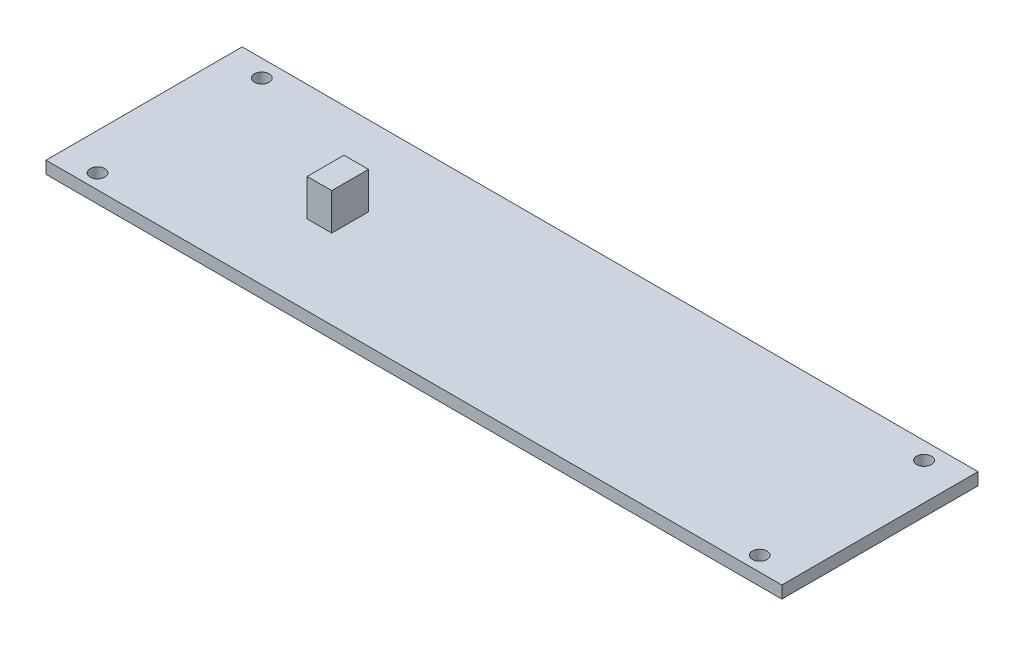
ISO-10303-21;
HEADER;
FILE_DESCRIPTION(('STEP AP214'),'2;1');
FILE_NAME('part.step','',(''),(''),'','','');
FILE_SCHEMA(('AUTOMOTIVE_DESIGN { 1 0 10303 214 1 1 1 1 }'));
ENDSEC;
DATA;
#1=APPLICATION_CONTEXT('core data for automotive mechanical design processes');
#2=APPLICATION_PROTOCOL_DEFINITION('international standard','automotive_design',2000,#1);
#3=PRODUCT_CONTEXT('',#1,'mechanical');
#4=PRODUCT('Part','Part','',(#3));
#5=PRODUCT_RELATED_PRODUCT_CATEGORY('part','',(#4));
#6=PRODUCT_DEFINITION_FORMATION('','',#4);
#7=PRODUCT_DEFINITION_CONTEXT('part definition',#1,'design');
#8=PRODUCT_DEFINITION('design','',#6,#7);
#9=PRODUCT_DEFINITION_SHAPE('','',#8);
#10=(LENGTH_UNIT() NAMED_UNIT(*) SI_UNIT(.MILLI.,.METRE.));
#11=(NAMED_UNIT(*) PLANE_ANGLE_UNIT() SI_UNIT($,.RADIAN.));
#12=(NAMED_UNIT(*) SI_UNIT($,.STERADIAN.) SOLID_ANGLE_UNIT());
#13=UNCERTAINTY_MEASURE_WITH_UNIT(LENGTH_MEASURE(1.E-05),#10,'distance_accuracy_value','');
#14=(GEOMETRIC_REPRESENTATION_CONTEXT(3) GLOBAL_UNCERTAINTY_ASSIGNED_CONTEXT((#13)) GLOBAL_UNIT_ASSIGNED_CONTEXT((#10,
#11,#12)) REPRESENTATION_CONTEXT('',''));
#15=CARTESIAN_POINT('',(0.,0.,0.));
#16=DIRECTION('',(0.,0.,1.));
#17=DIRECTION('',(1.,0.,0.));
#18=AXIS2_PLACEMENT_3D('',#15,#16,#17);
#19=CARTESIAN_POINT('',(0.,5.,0.));
#20=DIRECTION('',(0.,1.,0.));
#21=DIRECTION('',(0.,0.,1.));
#22=AXIS2_PLACEMENT_3D('',#19,#20,#21);
#23=PLANE('',#22);
#24=CARTESIAN_POINT('',(15.,5.,74.));
#25=DIRECTION('',(0.,1.,0.));
#26=DIRECTION('',(0.,0.,1.));
#27=AXIS2_PLACEMENT_3D('',#24,#25,#26);
#28=CIRCLE('',#27,3.);
#29=CARTESIAN_POINT('',(15.,5.,77.));
#30=VERTEX_POINT('',#29);
#31=EDGE_CURVE('E155',#30,#30,#28,.T.);
#32=ORIENTED_EDGE('',*,*,#31,.F.);
#33=EDGE_LOOP('',(#32));
#34=FACE_BOUND('',#33,.T.);
#35=CARTESIAN_POINT('',(285.,5.,7.));
#36=DIRECTION('',(0.,1.,0.));
#37=DIRECTION('',(0.,0.,-1.));
#38=AXIS2_PLACEMENT_3D('',#35,#36,#37);
#39=CIRCLE('',#38,3.00000000000005);
#40=CARTESIAN_POINT('',(285.,5.,3.99999999999995));
#41=VERTEX_POINT('',#40);
#42=EDGE_CURVE('E148',#41,#41,#39,.T.);
#43=ORIENTED_EDGE('',*,*,#42,.F.);
#44=EDGE_LOOP('',(#43));
#45=FACE_BOUND('',#44,.T.);
#46=CARTESIAN_POINT('',(285.,5.,74.));
#47=DIRECTION('',(0.,1.,0.));
#48=DIRECTION('',(0.,0.,-1.));
#49=AXIS2_PLACEMENT_3D('',#46,#47,#48);
#50=CIRCLE('',#49,3.00000000000005);
#51=CARTESIAN_POINT('',(285.,5.,71.));
#52=VERTEX_POINT('',#51);
#53=EDGE_CURVE('E144',#52,#52,#50,.T.);
#54=ORIENTED_EDGE('',*,*,#53,.F.);
#55=EDGE_LOOP('',(#54));
#56=FACE_BOUND('',#55,.T.);
#57=CARTESIAN_POINT('',(15.,5.,7.));
#58=DIRECTION('',(0.,1.,0.));
#59=DIRECTION('',(0.,0.,1.));
#60=AXIS2_PLACEMENT_3D('',#57,#58,#59);
#61=CIRCLE('',#60,3.);
#62=CARTESIAN_POINT('',(15.,5.,10.));
#63=VERTEX_POINT('',#62);
#64=EDGE_CURVE('E154',#63,#63,#61,.T.);
#65=ORIENTED_EDGE('',*,*,#64,.F.);
#66=EDGE_LOOP('',(#65));
#67=FACE_BOUND('',#66,.T.);
#68=DIRECTION('',(0.,0.,1.));
#69=VECTOR('',#68,1.);
#70=CARTESIAN_POINT('',(0.,5.,0.));
#71=LINE('',#70,#69);
#72=CARTESIAN_POINT('',(0.,5.,0.));
#73=VERTEX_POINT('',#72);
#74=CARTESIAN_POINT('',(0.,5.,80.));
#75=VERTEX_POINT('',#74);
#76=EDGE_CURVE('E169',#73,#75,#71,.T.);
#77=ORIENTED_EDGE('',*,*,#76,.T.);
#78=DIRECTION('',(1.,0.,0.));
#79=VECTOR('',#78,1.);
#80=CARTESIAN_POINT('',(0.,5.,80.));
#81=LINE('',#80,#79);
#82=CARTESIAN_POINT('',(300.,5.,80.));
#83=VERTEX_POINT('',#82);
#84=EDGE_CURVE('E85',#75,#83,#81,.T.);
#85=ORIENTED_EDGE('',*,*,#84,.T.);
#86=DIRECTION('',(0.,0.,-1.));
#87=VECTOR('',#86,1.);
#88=CARTESIAN_POINT('',(300.,5.,0.));
#89=LINE('',#88,#87);
#90=CARTESIAN_POINT('',(300.,5.,0.));
#91=VERTEX_POINT('',#90);
#92=EDGE_CURVE('E172',#83,#91,#89,.T.);
#93=ORIENTED_EDGE('',*,*,#92,.T.);
#94=DIRECTION('',(-1.,0.,0.));
#95=VECTOR('',#94,1.);
#96=CARTESIAN_POINT('',(0.,5.,0.));
#97=LINE('',#96,#95);
#98=EDGE_CURVE('E57',#91,#73,#97,.T.);
#99=ORIENTED_EDGE('',*,*,#98,.T.);
#100=EDGE_LOOP('',(#77,#85,#93,#99));
#101=FACE_BOUND('',#100,.T.);
#102=DIRECTION('',(1.,0.,0.));
#103=VECTOR('',#102,1.);
#104=CARTESIAN_POINT('',(0.,5.,32.5));
#105=LINE('',#104,#103);
#106=CARTESIAN_POINT('',(74.,5.,32.5));
#107=VERTEX_POINT('',#106);
#108=CARTESIAN_POINT('',(84.,5.,32.5));
#109=VERTEX_POINT('',#108);
#110=EDGE_CURVE('E141',#107,#109,#105,.T.);
#111=ORIENTED_EDGE('',*,*,#110,.T.);
#112=DIRECTION('',(0.,0.,1.));
#113=VECTOR('',#112,1.);
#114=CARTESIAN_POINT('',(84.,5.,0.));
#115=LINE('',#114,#113);
#116=CARTESIAN_POINT('',(84.,5.,47.5));
#117=VERTEX_POINT('',#116);
#118=EDGE_CURVE('E130',#109,#117,#115,.T.);
#119=ORIENTED_EDGE('',*,*,#118,.T.);
#120=DIRECTION('',(-1.,0.,0.));
#121=VECTOR('',#120,1.);
#122=CARTESIAN_POINT('',(0.,5.,47.5));
#123=LINE('',#122,#121);
#124=CARTESIAN_POINT('',(74.,5.,47.5));
#125=VERTEX_POINT('',#124);
#126=EDGE_CURVE('E131',#117,#125,#123,.T.);
#127=ORIENTED_EDGE('',*,*,#126,.T.);
#128=DIRECTION('',(0.,0.,-1.));
#129=VECTOR('',#128,1.);
#130=CARTESIAN_POINT('',(74.,5.,0.));
#131=LINE('',#130,#129);
#132=EDGE_CURVE('E134',#125,#107,#131,.T.);
#133=ORIENTED_EDGE('',*,*,#132,.T.);
#134=EDGE_LOOP('',(#111,#119,#127,#133));
#135=FACE_BOUND('',#134,.T.);
#136=ADVANCED_FACE('F33',(#34,#45,#56,#67,#101,#135),#23,.T.);
#137=CARTESIAN_POINT('',(0.,5.,0.));
#138=DIRECTION('',(1.,0.,0.));
#139=DIRECTION('',(0.,0.,-1.));
#140=AXIS2_PLACEMENT_3D('',#137,#138,#139);
#141=PLANE('',#140);
#142=DIRECTION('',(0.,0.,1.));
#143=VECTOR('',#142,1.);
#144=CARTESIAN_POINT('',(0.,0.,0.));
#145=LINE('',#144,#143);
#146=CARTESIAN_POINT('',(0.,0.,0.));
#147=VERTEX_POINT('',#146);
#148=CARTESIAN_POINT('',(0.,0.,80.));
#149=VERTEX_POINT('',#148);
#150=EDGE_CURVE('E166',#147,#149,#145,.T.);
#151=ORIENTED_EDGE('',*,*,#150,.T.);
#152=DIRECTION('',(0.,-1.,0.));
#153=VECTOR('',#152,1.);
#154=CARTESIAN_POINT('',(0.,5.,80.));
#155=LINE('',#154,#153);
#156=EDGE_CURVE('E11',#75,#149,#155,.T.);
#157=ORIENTED_EDGE('',*,*,#156,.F.);
#158=ORIENTED_EDGE('',*,*,#76,.F.);
#159=DIRECTION('',(0.,-1.,0.));
#160=VECTOR('',#159,1.);
#161=CARTESIAN_POINT('',(0.,5.,0.));
#162=LINE('',#161,#160);
#163=EDGE_CURVE('E175',#73,#147,#162,.T.);
#164=ORIENTED_EDGE('',*,*,#163,.T.);
#165=EDGE_LOOP('',(#151,#157,#158,#164));
#166=FACE_BOUND('',#165,.T.);
#167=ADVANCED_FACE('F35',(#166),#141,.F.);
#168=CARTESIAN_POINT('',(0.,5.,80.));
#169=DIRECTION('',(0.,0.,-1.));
#170=DIRECTION('',(-1.,0.,0.));
#171=AXIS2_PLACEMENT_3D('',#168,#169,#170);
#172=PLANE('',#171);
#173=DIRECTION('',(1.,0.,0.));
#174=VECTOR('',#173,1.);
#175=CARTESIAN_POINT('',(0.,0.,80.));
#176=LINE('',#175,#174);
#177=CARTESIAN_POINT('',(300.,0.,80.));
#178=VERTEX_POINT('',#177);
#179=EDGE_CURVE('E178',#149,#178,#176,.T.);
#180=ORIENTED_EDGE('',*,*,#179,.T.);
#181=DIRECTION('',(0.,-1.,0.));
#182=VECTOR('',#181,1.);
#183=CARTESIAN_POINT('',(300.,5.,80.));
#184=LINE('',#183,#182);
#185=EDGE_CURVE('E41',#83,#178,#184,.T.);
#186=ORIENTED_EDGE('',*,*,#185,.F.);
#187=ORIENTED_EDGE('',*,*,#84,.F.);
#188=ORIENTED_EDGE('',*,*,#156,.T.);
#189=EDGE_LOOP('',(#180,#186,#187,#188));
#190=FACE_BOUND('',#189,.T.);
#191=ADVANCED_FACE('F207',(#190),#172,.F.);
#192=CARTESIAN_POINT('',(300.,5.,0.));
#193=DIRECTION('',(-1.,0.,0.));
#194=DIRECTION('',(0.,0.,1.));
#195=AXIS2_PLACEMENT_3D('',#192,#193,#194);
#196=PLANE('',#195);
#197=DIRECTION('',(0.,0.,-1.));
#198=VECTOR('',#197,1.);
#199=CARTESIAN_POINT('',(300.,0.,0.));
#200=LINE('',#199,#198);
#201=CARTESIAN_POINT('',(300.,0.,0.));
#202=VERTEX_POINT('',#201);
#203=EDGE_CURVE('E180',#178,#202,#200,.T.);
#204=ORIENTED_EDGE('',*,*,#203,.T.);
#205=DIRECTION('',(0.,-1.,0.));
#206=VECTOR('',#205,1.);
#207=CARTESIAN_POINT('',(300.,5.,0.));
#208=LINE('',#207,#206);
#209=EDGE_CURVE('E184',#91,#202,#208,.T.);
#210=ORIENTED_EDGE('',*,*,#209,.F.);
#211=ORIENTED_EDGE('',*,*,#92,.F.);
#212=ORIENTED_EDGE('',*,*,#185,.T.);
#213=EDGE_LOOP('',(#204,#210,#211,#212));
#214=FACE_BOUND('',#213,.T.);
#215=ADVANCED_FACE('F189',(#214),#196,.F.);
#216=CARTESIAN_POINT('',(0.,5.,0.));
#217=DIRECTION('',(0.,0.,1.));
#218=DIRECTION('',(1.,0.,0.));
#219=AXIS2_PLACEMENT_3D('',#216,#217,#218);
#220=PLANE('',#219);
#221=DIRECTION('',(-1.,0.,0.));
#222=VECTOR('',#221,1.);
#223=CARTESIAN_POINT('',(0.,0.,0.));
#224=LINE('',#223,#222);
#225=EDGE_CURVE('E78',#202,#147,#224,.T.);
#226=ORIENTED_EDGE('',*,*,#225,.T.);
#227=ORIENTED_EDGE('',*,*,#163,.F.);
#228=ORIENTED_EDGE('',*,*,#98,.F.);
#229=ORIENTED_EDGE('',*,*,#209,.T.);
#230=EDGE_LOOP('',(#226,#227,#228,#229));
#231=FACE_BOUND('',#230,.T.);
#232=ADVANCED_FACE('F198',(#231),#220,.F.);
#233=CARTESIAN_POINT('',(0.,0.,0.));
#234=DIRECTION('',(0.,1.,0.));
#235=DIRECTION('',(0.,0.,1.));
#236=AXIS2_PLACEMENT_3D('',#233,#234,#235);
#237=PLANE('',#236);
#238=ORIENTED_EDGE('',*,*,#150,.F.);
#239=ORIENTED_EDGE('',*,*,#225,.F.);
#240=ORIENTED_EDGE('',*,*,#203,.F.);
#241=ORIENTED_EDGE('',*,*,#179,.F.);
#242=EDGE_LOOP('',(#238,#239,#240,#241));
#243=FACE_BOUND('',#242,.T.);
#244=CARTESIAN_POINT('',(15.,0.,7.));
#245=DIRECTION('',(0.,1.,0.));
#246=DIRECTION('',(0.,0.,1.));
#247=AXIS2_PLACEMENT_3D('',#244,#245,#246);
#248=CIRCLE('',#247,3.);
#249=CARTESIAN_POINT('',(15.,0.,10.));
#250=VERTEX_POINT('',#249);
#251=EDGE_CURVE('E163',#250,#250,#248,.T.);
#252=ORIENTED_EDGE('',*,*,#251,.T.);
#253=EDGE_LOOP('',(#252));
#254=FACE_BOUND('',#253,.T.);
#255=CARTESIAN_POINT('',(285.,0.,74.));
#256=DIRECTION('',(0.,1.,0.));
#257=DIRECTION('',(0.,0.,-1.));
#258=AXIS2_PLACEMENT_3D('',#255,#256,#257);
#259=CIRCLE('',#258,3.00000000000005);
#260=CARTESIAN_POINT('',(285.,0.,71.));
#261=VERTEX_POINT('',#260);
#262=EDGE_CURVE('E145',#261,#261,#259,.T.);
#263=ORIENTED_EDGE('',*,*,#262,.T.);
#264=EDGE_LOOP('',(#263));
#265=FACE_BOUND('',#264,.T.);
#266=CARTESIAN_POINT('',(285.,0.,7.));
#267=DIRECTION('',(0.,1.,0.));
#268=DIRECTION('',(0.,0.,-1.));
#269=AXIS2_PLACEMENT_3D('',#266,#267,#268);
#270=CIRCLE('',#269,3.00000000000005);
#271=CARTESIAN_POINT('',(285.,0.,3.99999999999995));
#272=VERTEX_POINT('',#271);
#273=EDGE_CURVE('E158',#272,#272,#270,.T.);
#274=ORIENTED_EDGE('',*,*,#273,.T.);
#275=EDGE_LOOP('',(#274));
#276=FACE_BOUND('',#275,.T.);
#277=CARTESIAN_POINT('',(15.,0.,74.));
#278=DIRECTION('',(0.,1.,0.));
#279=DIRECTION('',(0.,0.,1.));
#280=AXIS2_PLACEMENT_3D('',#277,#278,#279);
#281=CIRCLE('',#280,3.);
#282=CARTESIAN_POINT('',(15.,0.,77.));
#283=VERTEX_POINT('',#282);
#284=EDGE_CURVE('E151',#283,#283,#281,.T.);
#285=ORIENTED_EDGE('',*,*,#284,.T.);
#286=EDGE_LOOP('',(#285));
#287=FACE_BOUND('',#286,.T.);
#288=ADVANCED_FACE('F193',(#243,#254,#265,#276,#287),#237,.F.);
#289=CARTESIAN_POINT('',(15.,0.,7.));
#290=DIRECTION('',(0.,1.,0.));
#291=DIRECTION('',(0.,0.,1.));
#292=AXIS2_PLACEMENT_3D('',#289,#290,#291);
#293=CYLINDRICAL_SURFACE('',#292,3.);
#294=ORIENTED_EDGE('',*,*,#251,.F.);
#295=EDGE_LOOP('',(#294));
#296=FACE_BOUND('',#295,.T.);
#297=ORIENTED_EDGE('',*,*,#64,.T.);
#298=EDGE_LOOP('',(#297));
#299=FACE_BOUND('',#298,.T.);
#300=ADVANCED_FACE('F205',(#296,#299),#293,.F.);
#301=CARTESIAN_POINT('',(285.,0.,74.));
#302=DIRECTION('',(0.,1.,0.));
#303=DIRECTION('',(0.,0.,1.));
#304=AXIS2_PLACEMENT_3D('',#301,#302,#303);
#305=CYLINDRICAL_SURFACE('',#304,3.00000000000005);
#306=ORIENTED_EDGE('',*,*,#262,.F.);
#307=EDGE_LOOP('',(#306));
#308=FACE_BOUND('',#307,.T.);
#309=ORIENTED_EDGE('',*,*,#53,.T.);
#310=EDGE_LOOP('',(#309));
#311=FACE_BOUND('',#310,.T.);
#312=ADVANCED_FACE('F220',(#308,#311),#305,.F.);
#313=CARTESIAN_POINT('',(285.,0.,7.));
#314=DIRECTION('',(0.,1.,0.));
#315=DIRECTION('',(0.,0.,1.));
#316=AXIS2_PLACEMENT_3D('',#313,#314,#315);
#317=CYLINDRICAL_SURFACE('',#316,3.00000000000005);
#318=ORIENTED_EDGE('',*,*,#273,.F.);
#319=EDGE_LOOP('',(#318));
#320=FACE_BOUND('',#319,.T.);
#321=ORIENTED_EDGE('',*,*,#42,.T.);
#322=EDGE_LOOP('',(#321));
#323=FACE_BOUND('',#322,.T.);
#324=ADVANCED_FACE('F222',(#320,#323),#317,.F.);
#325=CARTESIAN_POINT('',(15.,0.,74.));
#326=DIRECTION('',(0.,1.,0.));
#327=DIRECTION('',(0.,0.,1.));
#328=AXIS2_PLACEMENT_3D('',#325,#326,#327);
#329=CYLINDRICAL_SURFACE('',#328,3.);
#330=ORIENTED_EDGE('',*,*,#284,.F.);
#331=EDGE_LOOP('',(#330));
#332=FACE_BOUND('',#331,.T.);
#333=ORIENTED_EDGE('',*,*,#31,.T.);
#334=EDGE_LOOP('',(#333));
#335=FACE_BOUND('',#334,.T.);
#336=ADVANCED_FACE('F225',(#332,#335),#329,.F.);
#337=CARTESIAN_POINT('',(84.,20.,47.5));
#338=DIRECTION('',(-1.,0.,0.));
#339=DIRECTION('',(0.,0.,1.));
#340=AXIS2_PLACEMENT_3D('',#337,#338,#339);
#341=PLANE('',#340);
#342=ORIENTED_EDGE('',*,*,#118,.F.);
#343=DIRECTION('',(0.,-1.,0.));
#344=VECTOR('',#343,1.);
#345=CARTESIAN_POINT('',(84.,20.,32.5));
#346=LINE('',#345,#344);
#347=CARTESIAN_POINT('',(84.,20.,32.5));
#348=VERTEX_POINT('',#347);
#349=EDGE_CURVE('E112',#348,#109,#346,.T.);
#350=ORIENTED_EDGE('',*,*,#349,.F.);
#351=DIRECTION('',(0.,0.,-1.));
#352=VECTOR('',#351,1.);
#353=CARTESIAN_POINT('',(84.,20.,47.5));
#354=LINE('',#353,#352);
#355=CARTESIAN_POINT('',(84.,20.,47.5));
#356=VERTEX_POINT('',#355);
#357=EDGE_CURVE('E119',#356,#348,#354,.T.);
#358=ORIENTED_EDGE('',*,*,#357,.F.);
#359=DIRECTION('',(0.,-1.,0.));
#360=VECTOR('',#359,1.);
#361=CARTESIAN_POINT('',(84.,20.,47.5));
#362=LINE('',#361,#360);
#363=EDGE_CURVE('E332',#356,#117,#362,.T.);
#364=ORIENTED_EDGE('',*,*,#363,.T.);
#365=EDGE_LOOP('',(#342,#350,#358,#364));
#366=FACE_BOUND('',#365,.T.);
#367=ADVANCED_FACE('F128',(#366),#341,.F.);
#368=CARTESIAN_POINT('',(84.,20.,32.5));
#369=DIRECTION('',(0.,0.,1.));
#370=DIRECTION('',(1.,0.,0.));
#371=AXIS2_PLACEMENT_3D('',#368,#369,#370);
#372=PLANE('',#371);
#373=ORIENTED_EDGE('',*,*,#110,.F.);
#374=DIRECTION('',(0.,-1.,0.));
#375=VECTOR('',#374,1.);
#376=CARTESIAN_POINT('',(74.,20.,32.5));
#377=LINE('',#376,#375);
#378=CARTESIAN_POINT('',(74.,20.,32.5));
#379=VERTEX_POINT('',#378);
#380=EDGE_CURVE('E115',#379,#107,#377,.T.);
#381=ORIENTED_EDGE('',*,*,#380,.F.);
#382=DIRECTION('',(-1.,0.,0.));
#383=VECTOR('',#382,1.);
#384=CARTESIAN_POINT('',(84.,20.,32.5));
#385=LINE('',#384,#383);
#386=EDGE_CURVE('E108',#348,#379,#385,.T.);
#387=ORIENTED_EDGE('',*,*,#386,.F.);
#388=ORIENTED_EDGE('',*,*,#349,.T.);
#389=EDGE_LOOP('',(#373,#381,#387,#388));
#390=FACE_BOUND('',#389,.T.);
#391=ADVANCED_FACE('F110',(#390),#372,.F.);
#392=CARTESIAN_POINT('',(74.,20.,47.5));
#393=DIRECTION('',(1.,0.,0.));
#394=DIRECTION('',(0.,0.,-1.));
#395=AXIS2_PLACEMENT_3D('',#392,#393,#394);
#396=PLANE('',#395);
#397=ORIENTED_EDGE('',*,*,#132,.F.);
#398=DIRECTION('',(0.,-1.,0.));
#399=VECTOR('',#398,1.);
#400=CARTESIAN_POINT('',(74.,20.,47.5));
#401=LINE('',#400,#399);
#402=CARTESIAN_POINT('',(74.,20.,47.5));
#403=VERTEX_POINT('',#402);
#404=EDGE_CURVE('E48',#403,#125,#401,.T.);
#405=ORIENTED_EDGE('',*,*,#404,.F.);
#406=DIRECTION('',(0.,0.,1.));
#407=VECTOR('',#406,1.);
#408=CARTESIAN_POINT('',(74.,20.,47.5));
#409=LINE('',#408,#407);
#410=EDGE_CURVE('E118',#379,#403,#409,.T.);
#411=ORIENTED_EDGE('',*,*,#410,.F.);
#412=ORIENTED_EDGE('',*,*,#380,.T.);
#413=EDGE_LOOP('',(#397,#405,#411,#412));
#414=FACE_BOUND('',#413,.T.);
#415=ADVANCED_FACE('F237',(#414),#396,.F.);
#416=CARTESIAN_POINT('',(84.,20.,47.5));
#417=DIRECTION('',(0.,0.,-1.));
#418=DIRECTION('',(-1.,0.,0.));
#419=AXIS2_PLACEMENT_3D('',#416,#417,#418);
#420=PLANE('',#419);
#421=ORIENTED_EDGE('',*,*,#126,.F.);
#422=ORIENTED_EDGE('',*,*,#363,.F.);
#423=DIRECTION('',(1.,0.,0.));
#424=VECTOR('',#423,1.);
#425=CARTESIAN_POINT('',(84.,20.,47.5));
#426=LINE('',#425,#424);
#427=EDGE_CURVE('E123',#403,#356,#426,.T.);
#428=ORIENTED_EDGE('',*,*,#427,.F.);
#429=ORIENTED_EDGE('',*,*,#404,.T.);
#430=EDGE_LOOP('',(#421,#422,#428,#429));
#431=FACE_BOUND('',#430,.T.);
#432=ADVANCED_FACE('F240',(#431),#420,.F.);
#433=CARTESIAN_POINT('',(0.,20.,0.));
#434=DIRECTION('',(0.,1.,0.));
#435=DIRECTION('',(0.,0.,1.));
#436=AXIS2_PLACEMENT_3D('',#433,#434,#435);
#437=PLANE('',#436);
#438=ORIENTED_EDGE('',*,*,#357,.T.);
#439=ORIENTED_EDGE('',*,*,#386,.T.);
#440=ORIENTED_EDGE('',*,*,#410,.T.);
#441=ORIENTED_EDGE('',*,*,#427,.T.);
#442=EDGE_LOOP('',(#438,#439,#440,#441));
#443=FACE_BOUND('',#442,.T.);
#444=ADVANCED_FACE('F122',(#443),#437,.T.);
#445=CLOSED_SHELL('',(#136,#167,#191,#215,#232,#288,#300,#312,#324,#336,#367,#391,#415,#432,#444));
#446=MANIFOLD_SOLID_BREP('B2',#445);
#447=ADVANCED_BREP_SHAPE_REPRESENTATION('',(#18,#446),#14);
#448=SHAPE_DEFINITION_REPRESENTATION(#9,#447);
ENDSEC;
END-ISO-10303-21;
